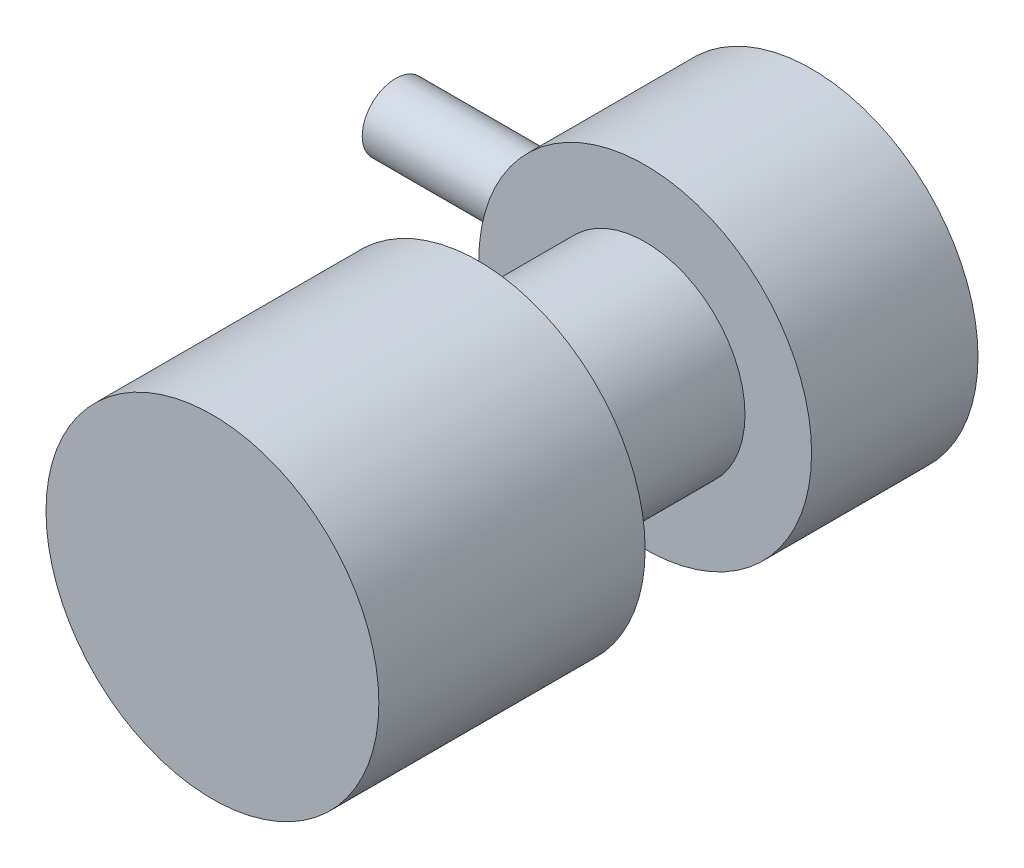
ISO-10303-21;
HEADER;
FILE_DESCRIPTION(('STEP AP214'),'2;1');
FILE_NAME('part.step','',(''),(''),'','','');
FILE_SCHEMA(('AUTOMOTIVE_DESIGN { 1 0 10303 214 1 1 1 1 }'));
ENDSEC;
DATA;
#1=APPLICATION_CONTEXT('core data for automotive mechanical design processes');
#2=APPLICATION_PROTOCOL_DEFINITION('international standard','automotive_design',2000,#1);
#3=PRODUCT_CONTEXT('',#1,'mechanical');
#4=PRODUCT('Part','Part','',(#3));
#5=PRODUCT_RELATED_PRODUCT_CATEGORY('part','',(#4));
#6=PRODUCT_DEFINITION_FORMATION('','',#4);
#7=PRODUCT_DEFINITION_CONTEXT('part definition',#1,'design');
#8=PRODUCT_DEFINITION('design','',#6,#7);
#9=PRODUCT_DEFINITION_SHAPE('','',#8);
#10=(LENGTH_UNIT() NAMED_UNIT(*) SI_UNIT(.MILLI.,.METRE.));
#11=(NAMED_UNIT(*) PLANE_ANGLE_UNIT() SI_UNIT($,.RADIAN.));
#12=(NAMED_UNIT(*) SI_UNIT($,.STERADIAN.) SOLID_ANGLE_UNIT());
#13=UNCERTAINTY_MEASURE_WITH_UNIT(LENGTH_MEASURE(1.E-05),#10,'distance_accuracy_value','');
#14=(GEOMETRIC_REPRESENTATION_CONTEXT(3) GLOBAL_UNCERTAINTY_ASSIGNED_CONTEXT((#13)) GLOBAL_UNIT_ASSIGNED_CONTEXT((#10,
#11,#12)) REPRESENTATION_CONTEXT('',''));
#15=CARTESIAN_POINT('',(0.,0.,0.));
#16=DIRECTION('',(0.,0.,1.));
#17=DIRECTION('',(1.,0.,0.));
#18=AXIS2_PLACEMENT_3D('',#15,#16,#17);
#19=CARTESIAN_POINT('',(0.,0.,5.));
#20=DIRECTION('',(0.,0.,-1.));
#21=DIRECTION('',(-1.,0.,0.));
#22=AXIS2_PLACEMENT_3D('',#19,#20,#21);
#23=CYLINDRICAL_SURFACE('',#22,5.);
#24=CARTESIAN_POINT('',(0.,0.,5.));
#25=DIRECTION('',(0.,0.,1.));
#26=DIRECTION('',(1.,0.,0.));
#27=AXIS2_PLACEMENT_3D('',#24,#25,#26);
#28=CIRCLE('',#27,5.);
#29=CARTESIAN_POINT('',(5.,0.,5.));
#30=VERTEX_POINT('',#29);
#31=EDGE_CURVE('E49',#30,#30,#28,.T.);
#32=ORIENTED_EDGE('',*,*,#31,.F.);
#33=EDGE_LOOP('',(#32));
#34=FACE_BOUND('',#33,.T.);
#35=CARTESIAN_POINT('',(0.,0.,0.));
#36=DIRECTION('',(0.,0.,1.));
#37=DIRECTION('',(1.,0.,0.));
#38=AXIS2_PLACEMENT_3D('',#35,#36,#37);
#39=CIRCLE('',#38,5.);
#40=CARTESIAN_POINT('',(5.,0.,0.));
#41=VERTEX_POINT('',#40);
#42=EDGE_CURVE('E54',#41,#41,#39,.T.);
#43=ORIENTED_EDGE('',*,*,#42,.T.);
#44=EDGE_LOOP('',(#43));
#45=FACE_BOUND('',#44,.T.);
#46=CARTESIAN_POINT('',(-5.,0.,3.5));
#47=CARTESIAN_POINT('',(-4.99999897580871,0.0555769067926332,3.49999795550166));
#48=CARTESIAN_POINT('',(-4.99906385178231,0.111179660201522,3.49535115703235));
#49=CARTESIAN_POINT('',(-4.99542365623231,0.220813507689019,3.47690149988475));
#50=CARTESIAN_POINT('',(-4.99271717860186,0.274843317541356,3.46309136719849));
#51=CARTESIAN_POINT('',(-4.98583649278287,0.379730305263313,3.42675872637921));
#52=CARTESIAN_POINT('',(-4.98166369076718,0.430590467933134,3.40424456315531));
#53=CARTESIAN_POINT('',(-4.97230398035314,0.527807988864226,3.35116775248871));
#54=CARTESIAN_POINT('',(-4.96711713235707,0.574165615075812,3.32060558439279));
#55=CARTESIAN_POINT('',(-4.9562216532997,0.661693477314865,3.25186150570857));
#56=CARTESIAN_POINT('',(-4.95050745504347,0.702793951158525,3.2135916446088));
#57=CARTESIAN_POINT('',(-4.93924180452588,0.778036756608028,3.1307075836083));
#58=CARTESIAN_POINT('',(-4.93369036500424,0.812178544770425,3.08609288866488));
#59=CARTESIAN_POINT('',(-4.92332441812615,0.87283175334762,2.99128380698812));
#60=CARTESIAN_POINT('',(-4.91851707364946,0.899270938865867,2.94104235620364));
#61=CARTESIAN_POINT('',(-4.91026268058418,0.943305666580308,2.83671818099592));
#62=CARTESIAN_POINT('',(-4.90681549761962,0.960902082437238,2.78263583665365));
#63=CARTESIAN_POINT('',(-4.90172805252204,0.986525299884827,2.67291563609208));
#64=CARTESIAN_POINT('',(-4.90006470107188,0.994674497958777,2.61730745585777));
#65=CARTESIAN_POINT('',(-4.89866375060627,1.00155212772612,2.50549017863566));
#66=CARTESIAN_POINT('',(-4.89892595467841,1.0002815227135,2.44928114367986));
#67=CARTESIAN_POINT('',(-4.90132551148185,0.988454573101819,2.338753211979));
#68=CARTESIAN_POINT('',(-4.90343452858763,0.978038540243906,2.28441859437269));
#69=CARTESIAN_POINT('',(-4.90924546160001,0.948437884623051,2.178283923337));
#70=CARTESIAN_POINT('',(-4.91294745357779,0.929252843100681,2.12648399108099));
#71=CARTESIAN_POINT('',(-4.92155618500408,0.88252478367472,2.0264847382964));
#72=CARTESIAN_POINT('',(-4.92647089813704,0.854926151232115,1.97831212043083));
#73=CARTESIAN_POINT('',(-4.93694618773062,0.792193574572679,1.88722915002719));
#74=CARTESIAN_POINT('',(-4.94250683838366,0.757058764356829,1.84431940314884));
#75=CARTESIAN_POINT('',(-4.95377021241462,0.679499934560584,1.76417059754306));
#76=CARTESIAN_POINT('',(-4.95947369210905,0.636956161212445,1.72704743214087));
#77=CARTESIAN_POINT('',(-4.97028848714408,0.54618502406201,1.66044615369878));
#78=CARTESIAN_POINT('',(-4.97539979488974,0.497957587379389,1.63096813870642));
#79=CARTESIAN_POINT('',(-4.98446690160887,0.397059386878921,1.58047249077402));
#80=CARTESIAN_POINT('',(-4.98842088848272,0.3443818195853,1.55946810635546));
#81=CARTESIAN_POINT('',(-4.99471408987858,0.236148976448665,1.52663952596143));
#82=CARTESIAN_POINT('',(-4.99705350000531,0.180594050072449,1.51481421792637));
#83=CARTESIAN_POINT('',(-4.99982671866868,0.0691794056271504,1.50084354620572));
#84=CARTESIAN_POINT('',(-5.0002917465247,0.0133403283255762,1.49853958045973));
#85=CARTESIAN_POINT('',(-4.99935051930103,-0.0979249341927141,1.50324985894218));
#86=CARTESIAN_POINT('',(-4.99794436941446,-0.153351142443793,1.5102635793526));
#87=CARTESIAN_POINT('',(-4.99343832008018,-0.261705659946541,1.53327837354396));
#88=CARTESIAN_POINT('',(-4.99035376404206,-0.314651948339903,1.5491980684979));
#89=CARTESIAN_POINT('',(-4.98283552061033,-0.417123627499667,1.58948398265581));
#90=CARTESIAN_POINT('',(-4.97840173214227,-0.46664876163754,1.61385083467683));
#91=CARTESIAN_POINT('',(-4.96859911533294,-0.561541173686218,1.67068249065131));
#92=CARTESIAN_POINT('',(-4.96321950437052,-0.606850126752188,1.70324278103895));
#93=CARTESIAN_POINT('',(-4.95214734829882,-0.691418019119207,1.77540919120728));
#94=CARTESIAN_POINT('',(-4.94645476968388,-0.730676308930762,1.81501606639987));
#95=CARTESIAN_POINT('',(-4.93529303556965,-0.802640590774176,1.90087335189112));
#96=CARTESIAN_POINT('',(-4.92982860233304,-0.835237702448655,1.94721574422134));
#97=CARTESIAN_POINT('',(-4.91984191796194,-0.892185420051206,2.04481136135668));
#98=CARTESIAN_POINT('',(-4.91531962913342,-0.916536355922903,2.09606438957355));
#99=CARTESIAN_POINT('',(-4.90776740584383,-0.95615184158196,2.20176824614955));
#100=CARTESIAN_POINT('',(-4.90472974872187,-0.971463499791051,2.25620084121032));
#101=CARTESIAN_POINT('',(-4.90047436792025,-0.992708651627196,2.3669334534909));
#102=CARTESIAN_POINT('',(-4.89925640691111,-0.998643368225113,2.42323322620935));
#103=CARTESIAN_POINT('',(-4.89879149631379,-1.00092091086747,2.53500886454432));
#104=CARTESIAN_POINT('',(-4.89950919189301,-0.997435788070896,2.59048114892701));
#105=CARTESIAN_POINT('',(-4.90275573484614,-0.981352304100061,2.70003164990503));
#106=CARTESIAN_POINT('',(-4.90528456767169,-0.968754016129299,2.7541098776948));
#107=CARTESIAN_POINT('',(-4.91185264219159,-0.934878568498954,2.85922771124054));
#108=CARTESIAN_POINT('',(-4.9158882101883,-0.913622506717345,2.91027436050242));
#109=CARTESIAN_POINT('',(-4.9250171497417,-0.863054644601605,3.00810372073444));
#110=CARTESIAN_POINT('',(-4.93011060998894,-0.833742168774883,3.05488607372514));
#111=CARTESIAN_POINT('',(-4.94088960523225,-0.767305914786414,3.14371557215031));
#112=CARTESIAN_POINT('',(-4.94658372909699,-0.73005788723518,3.1856687652676));
#113=CARTESIAN_POINT('',(-4.95786081871955,-0.649064369013141,3.26278620552917));
#114=CARTESIAN_POINT('',(-4.96344375863184,-0.605317387153335,3.29794889031727));
#115=CARTESIAN_POINT('',(-4.97393832387971,-0.512017629088247,3.36083464394645));
#116=CARTESIAN_POINT('',(-4.97884231219246,-0.462408884429835,3.38847600328003));
#117=CARTESIAN_POINT('',(-4.98735125085,-0.359166360940733,3.43498612259659));
#118=CARTESIAN_POINT('',(-4.99095737138616,-0.305536260863126,3.45386278953249));
#119=CARTESIAN_POINT('',(-4.99576372595371,-0.209821488923779,3.47865194804472));
#120=CARTESIAN_POINT('',(-4.99734303158452,-0.168281664013784,3.48664319370776));
#121=CARTESIAN_POINT('',(-4.99946154139893,-0.0844995252100667,3.49731791235836));
#122=CARTESIAN_POINT('',(-5.00000077873155,-0.0422572337486189,3.50000155450977));
#123=CARTESIAN_POINT('',(-5.,0.,3.5));
#124=B_SPLINE_CURVE_WITH_KNOTS('',3,(#46,#47,#48,#49,#50,#51,#52,#53,#54,#55,#56,#57,#58,#59,
#60,#61,#62,#63,#64,#65,#66,#67,#68,#69,#70,#71,#72,#73,#74,#75,#76,#77,#78,#79,#80,#81,#82,#83,
#84,#85,#86,#87,#88,#89,#90,#91,#92,#93,#94,#95,#96,#97,#98,#99,#100,#101,#102,#103,#104,#105,
#106,#107,#108,#109,#110,#111,#112,#113,#114,#115,#116,#117,#118,#119,#120,#121,#122,#123),
.UNSPECIFIED.,.T.,.F.,(4,2,2,2,2,2,2,2,2,2,2,2,2,2,2,2,2,2,2,2,2,2,2,2,2,2,2,2,2,2,2,2,2,2,2,2,
2,2,4),(0.,0.166576130661259,0.333284650691323,0.499833735250342,0.666372902230863,
0.834932670112186,1.00350559674737,1.17361195005923,1.34370149365198,1.51156185103587,
1.67940504281225,1.84471727006278,2.0100373925373,2.17647490203593,2.3429315474967,
2.51238252491351,2.6818356753982,2.85155274854024,3.02124925698036,3.18810735676265,
3.35495607657868,3.52030453950723,3.68566539216022,3.85305066033359,4.0204538834593,
4.19040628579226,4.36035188723466,4.52940381032723,4.69843368330415,4.86439722567701,
5.03035943492608,5.1959196125311,5.36149367581867,5.52988076239143,5.6983065453293,
5.86849496675637,6.03852955517519,6.16518775289894,6.29184191370996),.UNSPECIFIED.);
#125=CARTESIAN_POINT('',(-5.,0.,3.5));
#126=VERTEX_POINT('',#125);
#127=EDGE_CURVE('E10',#126,#126,#124,.T.);
#128=ORIENTED_EDGE('',*,*,#127,.F.);
#129=EDGE_LOOP('',(#128));
#130=FACE_BOUND('',#129,.T.);
#131=ADVANCED_FACE('F34',(#34,#45,#130),#23,.T.);
#132=CARTESIAN_POINT('',(0.,0.,5.));
#133=DIRECTION('',(0.,0.,1.));
#134=DIRECTION('',(1.,0.,0.));
#135=AXIS2_PLACEMENT_3D('',#132,#133,#134);
#136=PLANE('',#135);
#137=CARTESIAN_POINT('',(0.,0.,5.));
#138=DIRECTION('',(0.,0.,1.));
#139=DIRECTION('',(1.,0.,0.));
#140=AXIS2_PLACEMENT_3D('',#137,#138,#139);
#141=CIRCLE('',#140,3.);
#142=CARTESIAN_POINT('',(3.,0.,5.));
#143=VERTEX_POINT('',#142);
#144=EDGE_CURVE('E45',#143,#143,#141,.T.);
#145=ORIENTED_EDGE('',*,*,#144,.F.);
#146=EDGE_LOOP('',(#145));
#147=FACE_BOUND('',#146,.T.);
#148=ORIENTED_EDGE('',*,*,#31,.T.);
#149=EDGE_LOOP('',(#148));
#150=FACE_BOUND('',#149,.T.);
#151=ADVANCED_FACE('F92',(#147,#150),#136,.T.);
#152=CARTESIAN_POINT('',(0.,0.,0.));
#153=DIRECTION('',(0.,0.,1.));
#154=DIRECTION('',(1.,0.,0.));
#155=AXIS2_PLACEMENT_3D('',#152,#153,#154);
#156=PLANE('',#155);
#157=ORIENTED_EDGE('',*,*,#42,.F.);
#158=EDGE_LOOP('',(#157));
#159=FACE_BOUND('',#158,.T.);
#160=ADVANCED_FACE('F97',(#159),#156,.F.);
#161=CARTESIAN_POINT('',(0.,0.,10.));
#162=DIRECTION('',(0.,0.,-1.));
#163=DIRECTION('',(-1.,0.,0.));
#164=AXIS2_PLACEMENT_3D('',#161,#162,#163);
#165=CYLINDRICAL_SURFACE('',#164,3.);
#166=CARTESIAN_POINT('',(0.,0.,10.));
#167=DIRECTION('',(0.,0.,1.));
#168=DIRECTION('',(1.,0.,0.));
#169=AXIS2_PLACEMENT_3D('',#166,#167,#168);
#170=CIRCLE('',#169,3.);
#171=CARTESIAN_POINT('',(3.,0.,10.));
#172=VERTEX_POINT('',#171);
#173=EDGE_CURVE('E57',#172,#172,#170,.T.);
#174=ORIENTED_EDGE('',*,*,#173,.F.);
#175=EDGE_LOOP('',(#174));
#176=FACE_BOUND('',#175,.T.);
#177=ORIENTED_EDGE('',*,*,#144,.T.);
#178=EDGE_LOOP('',(#177));
#179=FACE_BOUND('',#178,.T.);
#180=ADVANCED_FACE('F106',(#176,#179),#165,.T.);
#181=CARTESIAN_POINT('',(0.,0.,18.));
#182=DIRECTION('',(0.,0.,-1.));
#183=DIRECTION('',(-1.,0.,0.));
#184=AXIS2_PLACEMENT_3D('',#181,#182,#183);
#185=CYLINDRICAL_SURFACE('',#184,5.);
#186=CARTESIAN_POINT('',(0.,0.,18.));
#187=DIRECTION('',(0.,0.,1.));
#188=DIRECTION('',(1.,0.,0.));
#189=AXIS2_PLACEMENT_3D('',#186,#187,#188);
#190=CIRCLE('',#189,5.);
#191=CARTESIAN_POINT('',(5.,0.,18.));
#192=VERTEX_POINT('',#191);
#193=EDGE_CURVE('E63',#192,#192,#190,.T.);
#194=ORIENTED_EDGE('',*,*,#193,.F.);
#195=EDGE_LOOP('',(#194));
#196=FACE_BOUND('',#195,.T.);
#197=CARTESIAN_POINT('',(0.,0.,10.));
#198=DIRECTION('',(0.,0.,1.));
#199=DIRECTION('',(1.,0.,0.));
#200=AXIS2_PLACEMENT_3D('',#197,#198,#199);
#201=CIRCLE('',#200,5.);
#202=CARTESIAN_POINT('',(5.,0.,10.));
#203=VERTEX_POINT('',#202);
#204=EDGE_CURVE('E67',#203,#203,#201,.T.);
#205=ORIENTED_EDGE('',*,*,#204,.T.);
#206=EDGE_LOOP('',(#205));
#207=FACE_BOUND('',#206,.T.);
#208=ADVANCED_FACE('F111',(#196,#207),#185,.T.);
#209=CARTESIAN_POINT('',(0.,0.,18.));
#210=DIRECTION('',(0.,0.,1.));
#211=DIRECTION('',(1.,0.,0.));
#212=AXIS2_PLACEMENT_3D('',#209,#210,#211);
#213=PLANE('',#212);
#214=ORIENTED_EDGE('',*,*,#193,.T.);
#215=EDGE_LOOP('',(#214));
#216=FACE_BOUND('',#215,.T.);
#217=ADVANCED_FACE('F87',(#216),#213,.T.);
#218=CARTESIAN_POINT('',(0.,0.,10.));
#219=DIRECTION('',(0.,0.,1.));
#220=DIRECTION('',(1.,0.,0.));
#221=AXIS2_PLACEMENT_3D('',#218,#219,#220);
#222=PLANE('',#221);
#223=ORIENTED_EDGE('',*,*,#173,.T.);
#224=EDGE_LOOP('',(#223));
#225=FACE_BOUND('',#224,.T.);
#226=ORIENTED_EDGE('',*,*,#204,.F.);
#227=EDGE_LOOP('',(#226));
#228=FACE_BOUND('',#227,.T.);
#229=ADVANCED_FACE('F81',(#225,#228),#222,.F.);
#230=CARTESIAN_POINT('',(-10.,0.,2.5));
#231=DIRECTION('',(1.,0.,0.));
#232=DIRECTION('',(0.,0.,-1.));
#233=AXIS2_PLACEMENT_3D('',#230,#231,#232);
#234=CYLINDRICAL_SURFACE('',#233,1.);
#235=CARTESIAN_POINT('',(-10.,0.,2.5));
#236=DIRECTION('',(-1.,0.,0.));
#237=DIRECTION('',(0.,0.,1.));
#238=AXIS2_PLACEMENT_3D('',#235,#236,#237);
#239=CIRCLE('',#238,1.);
#240=CARTESIAN_POINT('',(-10.,0.,3.5));
#241=VERTEX_POINT('',#240);
#242=EDGE_CURVE('E72',#241,#241,#239,.T.);
#243=ORIENTED_EDGE('',*,*,#242,.F.);
#244=EDGE_LOOP('',(#243));
#245=FACE_BOUND('',#244,.T.);
#246=ORIENTED_EDGE('',*,*,#127,.T.);
#247=EDGE_LOOP('',(#246));
#248=FACE_BOUND('',#247,.T.);
#249=ADVANCED_FACE('F79',(#245,#248),#234,.T.);
#250=CARTESIAN_POINT('',(-10.,0.,2.5));
#251=DIRECTION('',(-1.,0.,0.));
#252=DIRECTION('',(0.,0.,1.));
#253=AXIS2_PLACEMENT_3D('',#250,#251,#252);
#254=PLANE('',#253);
#255=ORIENTED_EDGE('',*,*,#242,.T.);
#256=EDGE_LOOP('',(#255));
#257=FACE_BOUND('',#256,.T.);
#258=ADVANCED_FACE('F77',(#257),#254,.T.);
#259=CLOSED_SHELL('',(#131,#151,#160,#180,#208,#217,#229,#249,#258));
#260=MANIFOLD_SOLID_BREP('B2',#259);
#261=ADVANCED_BREP_SHAPE_REPRESENTATION('',(#18,#260),#14);
#262=SHAPE_DEFINITION_REPRESENTATION(#9,#261);
ENDSEC;
END-ISO-10303-21;
